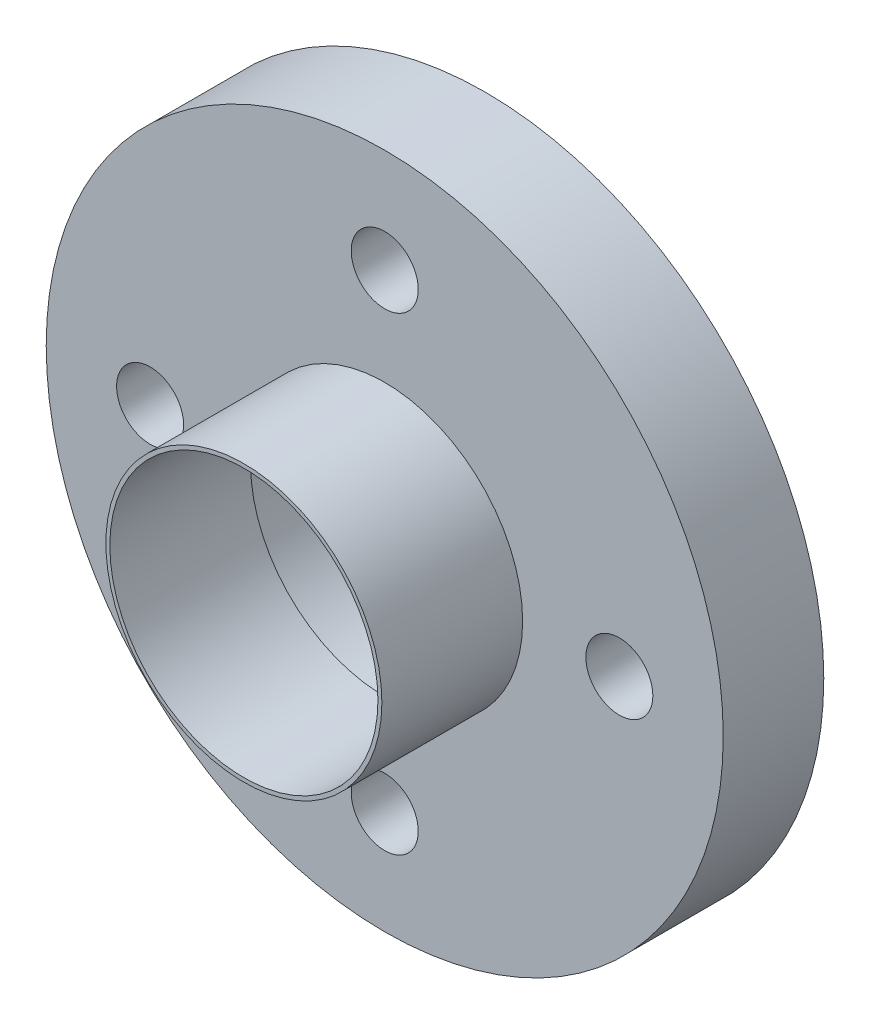
ISO-10303-21;
HEADER;
FILE_DESCRIPTION(('STEP AP214'),'2;1');
FILE_NAME('part.step','',(''),(''),'','','');
FILE_SCHEMA(('AUTOMOTIVE_DESIGN { 1 0 10303 214 1 1 1 1 }'));
ENDSEC;
DATA;
#1=APPLICATION_CONTEXT('core data for automotive mechanical design processes');
#2=APPLICATION_PROTOCOL_DEFINITION('international standard','automotive_design',2000,#1);
#3=PRODUCT_CONTEXT('',#1,'mechanical');
#4=PRODUCT('Part','Part','',(#3));
#5=PRODUCT_RELATED_PRODUCT_CATEGORY('part','',(#4));
#6=PRODUCT_DEFINITION_FORMATION('','',#4);
#7=PRODUCT_DEFINITION_CONTEXT('part definition',#1,'design');
#8=PRODUCT_DEFINITION('design','',#6,#7);
#9=PRODUCT_DEFINITION_SHAPE('','',#8);
#10=(LENGTH_UNIT() NAMED_UNIT(*) SI_UNIT(.MILLI.,.METRE.));
#11=(NAMED_UNIT(*) PLANE_ANGLE_UNIT() SI_UNIT($,.RADIAN.));
#12=(NAMED_UNIT(*) SI_UNIT($,.STERADIAN.) SOLID_ANGLE_UNIT());
#13=UNCERTAINTY_MEASURE_WITH_UNIT(LENGTH_MEASURE(1.E-05),#10,'distance_accuracy_value','');
#14=(GEOMETRIC_REPRESENTATION_CONTEXT(3) GLOBAL_UNCERTAINTY_ASSIGNED_CONTEXT((#13)) GLOBAL_UNIT_ASSIGNED_CONTEXT((#10,
#11,#12)) REPRESENTATION_CONTEXT('',''));
#15=CARTESIAN_POINT('',(0.,0.,0.));
#16=DIRECTION('',(0.,0.,1.));
#17=DIRECTION('',(1.,0.,0.));
#18=AXIS2_PLACEMENT_3D('',#15,#16,#17);
#19=CARTESIAN_POINT('',(-49.827317291707,-8.99276735050377,7.2));
#20=DIRECTION('',(0.,0.,1.));
#21=DIRECTION('',(1.,0.,0.));
#22=AXIS2_PLACEMENT_3D('',#19,#20,#21);
#23=PLANE('',#22);
#24=CARTESIAN_POINT('',(-49.827317291707,-8.99276735050377,7.2));
#25=DIRECTION('',(0.,0.,1.));
#26=DIRECTION('',(1.,0.,0.));
#27=AXIS2_PLACEMENT_3D('',#24,#25,#26);
#28=CIRCLE('',#27,4.1172952718397);
#29=CARTESIAN_POINT('',(-45.7100220198674,-8.99276735050377,7.2));
#30=VERTEX_POINT('',#29);
#31=EDGE_CURVE('E11',#30,#30,#28,.T.);
#32=ORIENTED_EDGE('',*,*,#31,.T.);
#33=EDGE_LOOP('',(#32));
#34=FACE_BOUND('',#33,.T.);
#35=CARTESIAN_POINT('',(-49.827317291707,-8.99276735050377,7.2));
#36=DIRECTION('',(0.,0.,1.));
#37=DIRECTION('',(1.,0.,0.));
#38=AXIS2_PLACEMENT_3D('',#35,#36,#37);
#39=CIRCLE('',#38,4.);
#40=CARTESIAN_POINT('',(-45.8273172917071,-8.99276735050377,7.2));
#41=VERTEX_POINT('',#40);
#42=EDGE_CURVE('E56',#41,#41,#39,.T.);
#43=ORIENTED_EDGE('',*,*,#42,.F.);
#44=EDGE_LOOP('',(#43));
#45=FACE_BOUND('',#44,.T.);
#46=ADVANCED_FACE('F45',(#34,#45),#23,.T.);
#47=CARTESIAN_POINT('',(-49.827317291707,-8.99276735050377,3.));
#48=DIRECTION('',(0.,0.,1.));
#49=DIRECTION('',(1.,0.,0.));
#50=AXIS2_PLACEMENT_3D('',#47,#48,#49);
#51=PLANE('',#50);
#52=CARTESIAN_POINT('',(-49.827317291707,-8.99276735050377,3.));
#53=DIRECTION('',(0.,0.,1.));
#54=DIRECTION('',(1.,0.,0.));
#55=AXIS2_PLACEMENT_3D('',#52,#53,#54);
#56=CIRCLE('',#55,4.1172952718397);
#57=CARTESIAN_POINT('',(-45.7100220198674,-8.99276735050377,3.));
#58=VERTEX_POINT('',#57);
#59=EDGE_CURVE('E49',#58,#58,#56,.T.);
#60=ORIENTED_EDGE('',*,*,#59,.F.);
#61=EDGE_LOOP('',(#60));
#62=FACE_BOUND('',#61,.T.);
#63=CARTESIAN_POINT('',(-49.827317291707,-8.99276735050377,3.));
#64=DIRECTION('',(0.,0.,1.));
#65=DIRECTION('',(1.,0.,0.));
#66=AXIS2_PLACEMENT_3D('',#63,#64,#65);
#67=CIRCLE('',#66,4.);
#68=CARTESIAN_POINT('',(-45.8273172917071,-8.99276735050377,3.));
#69=VERTEX_POINT('',#68);
#70=EDGE_CURVE('E58',#69,#69,#67,.T.);
#71=ORIENTED_EDGE('',*,*,#70,.T.);
#72=EDGE_LOOP('',(#71));
#73=FACE_BOUND('',#72,.T.);
#74=ADVANCED_FACE('F68',(#62,#73),#51,.F.);
#75=CARTESIAN_POINT('',(-49.827317291707,-8.99276735050377,7.2));
#76=DIRECTION('',(0.,0.,-1.));
#77=DIRECTION('',(-1.,0.,0.));
#78=AXIS2_PLACEMENT_3D('',#75,#76,#77);
#79=CYLINDRICAL_SURFACE('',#78,4.1172952718397);
#80=ORIENTED_EDGE('',*,*,#31,.F.);
#81=EDGE_LOOP('',(#80));
#82=FACE_BOUND('',#81,.T.);
#83=ORIENTED_EDGE('',*,*,#59,.T.);
#84=EDGE_LOOP('',(#83));
#85=FACE_BOUND('',#84,.T.);
#86=ADVANCED_FACE('F47',(#82,#85),#79,.T.);
#87=CARTESIAN_POINT('',(-49.827317291707,-8.99276735050377,7.2));
#88=DIRECTION('',(0.,0.,-1.));
#89=DIRECTION('',(-1.,0.,0.));
#90=AXIS2_PLACEMENT_3D('',#87,#88,#89);
#91=CYLINDRICAL_SURFACE('',#90,4.);
#92=ORIENTED_EDGE('',*,*,#42,.T.);
#93=EDGE_LOOP('',(#92));
#94=FACE_BOUND('',#93,.T.);
#95=ORIENTED_EDGE('',*,*,#70,.F.);
#96=EDGE_LOOP('',(#95));
#97=FACE_BOUND('',#96,.T.);
#98=ADVANCED_FACE('F64',(#94,#97),#91,.F.);
#99=CLOSED_SHELL('',(#46,#74,#86,#98));
#100=MANIFOLD_SOLID_BREP('B2',#99);
#101=CARTESIAN_POINT('',(-49.8250755436057,-8.97561797752809,3.));
#102=DIRECTION('',(0.,0.,-1.));
#103=DIRECTION('',(-1.,0.,0.));
#104=AXIS2_PLACEMENT_3D('',#101,#102,#103);
#105=PLANE('',#104);
#106=CARTESIAN_POINT('',(-49.8250755436057,-8.97561797752809,3.));
#107=DIRECTION('',(0.,0.,1.));
#108=DIRECTION('',(-1.,0.,0.));
#109=AXIS2_PLACEMENT_3D('',#106,#107,#108);
#110=CIRCLE('',#109,10.1);
#111=CARTESIAN_POINT('',(-59.9250755436057,-8.97561797752809,3.));
#112=VERTEX_POINT('',#111);
#113=EDGE_CURVE('E44',#112,#112,#110,.T.);
#114=ORIENTED_EDGE('',*,*,#113,.T.);
#115=EDGE_LOOP('',(#114));
#116=FACE_BOUND('',#115,.T.);
#117=CARTESIAN_POINT('',(-49.8250755436057,-15.9756179775281,3.));
#118=DIRECTION('',(0.,0.,1.));
#119=DIRECTION('',(1.,0.,0.));
#120=AXIS2_PLACEMENT_3D('',#117,#118,#119);
#121=CIRCLE('',#120,0.999999999999998);
#122=CARTESIAN_POINT('',(-48.8250755436057,-15.9756179775281,3.));
#123=VERTEX_POINT('',#122);
#124=EDGE_CURVE('E119',#123,#123,#121,.T.);
#125=ORIENTED_EDGE('',*,*,#124,.F.);
#126=EDGE_LOOP('',(#125));
#127=FACE_BOUND('',#126,.T.);
#128=CARTESIAN_POINT('',(-56.8250755436057,-8.97561797752807,3.));
#129=DIRECTION('',(0.,0.,1.));
#130=DIRECTION('',(1.,0.,0.));
#131=AXIS2_PLACEMENT_3D('',#128,#129,#130);
#132=CIRCLE('',#131,1.);
#133=CARTESIAN_POINT('',(-55.8250755436057,-8.97561797752807,3.));
#134=VERTEX_POINT('',#133);
#135=EDGE_CURVE('E125',#134,#134,#132,.T.);
#136=ORIENTED_EDGE('',*,*,#135,.F.);
#137=EDGE_LOOP('',(#136));
#138=FACE_BOUND('',#137,.T.);
#139=CARTESIAN_POINT('',(-49.8250755436056,-1.97561797752809,3.));
#140=DIRECTION('',(0.,0.,1.));
#141=DIRECTION('',(1.,0.,0.));
#142=AXIS2_PLACEMENT_3D('',#139,#140,#141);
#143=CIRCLE('',#142,1.);
#144=CARTESIAN_POINT('',(-48.8250755436056,-1.97561797752809,3.));
#145=VERTEX_POINT('',#144);
#146=EDGE_CURVE('E133',#145,#145,#143,.T.);
#147=ORIENTED_EDGE('',*,*,#146,.F.);
#148=EDGE_LOOP('',(#147));
#149=FACE_BOUND('',#148,.T.);
#150=CARTESIAN_POINT('',(-42.8250755436057,-8.97561797752817,3.));
#151=DIRECTION('',(0.,0.,1.));
#152=DIRECTION('',(1.,0.,0.));
#153=AXIS2_PLACEMENT_3D('',#150,#151,#152);
#154=CIRCLE('',#153,1.);
#155=CARTESIAN_POINT('',(-41.8250755436057,-8.97561797752817,3.));
#156=VERTEX_POINT('',#155);
#157=EDGE_CURVE('E141',#156,#156,#154,.T.);
#158=ORIENTED_EDGE('',*,*,#157,.F.);
#159=EDGE_LOOP('',(#158));
#160=FACE_BOUND('',#159,.T.);
#161=CARTESIAN_POINT('',(-49.8250755436057,-8.97561797752809,3.));
#162=DIRECTION('',(0.,0.,1.));
#163=DIRECTION('',(1.,0.,0.));
#164=AXIS2_PLACEMENT_3D('',#161,#162,#163);
#165=CIRCLE('',#164,4.1);
#166=CARTESIAN_POINT('',(-45.7250755436057,-8.97561797752809,3.));
#167=VERTEX_POINT('',#166);
#168=EDGE_CURVE('E149',#167,#167,#165,.T.);
#169=ORIENTED_EDGE('',*,*,#168,.F.);
#170=EDGE_LOOP('',(#169));
#171=FACE_BOUND('',#170,.T.);
#172=ADVANCED_FACE('F106',(#116,#127,#138,#149,#160,#171),#105,.F.);
#173=CARTESIAN_POINT('',(-49.8250755436057,-8.97561797752809,0.));
#174=DIRECTION('',(0.,0.,-1.));
#175=DIRECTION('',(-1.,0.,0.));
#176=AXIS2_PLACEMENT_3D('',#173,#174,#175);
#177=PLANE('',#176);
#178=CARTESIAN_POINT('',(-42.8250755436057,-8.97561797752817,0.));
#179=DIRECTION('',(0.,0.,1.));
#180=DIRECTION('',(1.,0.,0.));
#181=AXIS2_PLACEMENT_3D('',#178,#179,#180);
#182=CIRCLE('',#181,1.);
#183=CARTESIAN_POINT('',(-41.8250755436057,-8.97561797752817,0.));
#184=VERTEX_POINT('',#183);
#185=EDGE_CURVE('E145',#184,#184,#182,.T.);
#186=ORIENTED_EDGE('',*,*,#185,.T.);
#187=EDGE_LOOP('',(#186));
#188=FACE_BOUND('',#187,.T.);
#189=CARTESIAN_POINT('',(-56.8250755436057,-8.97561797752807,0.));
#190=DIRECTION('',(0.,0.,1.));
#191=DIRECTION('',(1.,0.,0.));
#192=AXIS2_PLACEMENT_3D('',#189,#190,#191);
#193=CIRCLE('',#192,1.);
#194=CARTESIAN_POINT('',(-55.8250755436057,-8.97561797752807,0.));
#195=VERTEX_POINT('',#194);
#196=EDGE_CURVE('E129',#195,#195,#193,.T.);
#197=ORIENTED_EDGE('',*,*,#196,.T.);
#198=EDGE_LOOP('',(#197));
#199=FACE_BOUND('',#198,.T.);
#200=CARTESIAN_POINT('',(-49.8250755436057,-8.97561797752809,0.));
#201=DIRECTION('',(0.,0.,1.));
#202=DIRECTION('',(1.,0.,0.));
#203=AXIS2_PLACEMENT_3D('',#200,#201,#202);
#204=CIRCLE('',#203,10.1);
#205=CARTESIAN_POINT('',(-39.7250755436057,-8.97561797752809,0.));
#206=VERTEX_POINT('',#205);
#207=EDGE_CURVE('E110',#206,#206,#204,.T.);
#208=ORIENTED_EDGE('',*,*,#207,.F.);
#209=EDGE_LOOP('',(#208));
#210=FACE_BOUND('',#209,.T.);
#211=CARTESIAN_POINT('',(-49.8250755436057,-15.9756179775281,0.));
#212=DIRECTION('',(0.,0.,1.));
#213=DIRECTION('',(1.,0.,0.));
#214=AXIS2_PLACEMENT_3D('',#211,#212,#213);
#215=CIRCLE('',#214,0.999999999999998);
#216=CARTESIAN_POINT('',(-48.8250755436057,-15.9756179775281,0.));
#217=VERTEX_POINT('',#216);
#218=EDGE_CURVE('E121',#217,#217,#215,.T.);
#219=ORIENTED_EDGE('',*,*,#218,.T.);
#220=EDGE_LOOP('',(#219));
#221=FACE_BOUND('',#220,.T.);
#222=CARTESIAN_POINT('',(-49.8250755436056,-1.97561797752809,0.));
#223=DIRECTION('',(0.,0.,1.));
#224=DIRECTION('',(1.,0.,0.));
#225=AXIS2_PLACEMENT_3D('',#222,#223,#224);
#226=CIRCLE('',#225,1.);
#227=CARTESIAN_POINT('',(-48.8250755436056,-1.97561797752809,0.));
#228=VERTEX_POINT('',#227);
#229=EDGE_CURVE('E137',#228,#228,#226,.T.);
#230=ORIENTED_EDGE('',*,*,#229,.T.);
#231=EDGE_LOOP('',(#230));
#232=FACE_BOUND('',#231,.T.);
#233=CARTESIAN_POINT('',(-49.8250755436057,-8.97561797752809,0.));
#234=DIRECTION('',(0.,0.,1.));
#235=DIRECTION('',(1.,0.,0.));
#236=AXIS2_PLACEMENT_3D('',#233,#234,#235);
#237=CIRCLE('',#236,4.1);
#238=CARTESIAN_POINT('',(-45.7250755436057,-8.97561797752809,0.));
#239=VERTEX_POINT('',#238);
#240=EDGE_CURVE('E153',#239,#239,#237,.T.);
#241=ORIENTED_EDGE('',*,*,#240,.T.);
#242=EDGE_LOOP('',(#241));
#243=FACE_BOUND('',#242,.T.);
#244=ADVANCED_FACE('F165',(#188,#199,#210,#221,#232,#243),#177,.T.);
#245=CARTESIAN_POINT('',(-49.8250755436057,-8.97561797752809,3.));
#246=DIRECTION('',(0.,0.,-1.));
#247=DIRECTION('',(-1.,0.,0.));
#248=AXIS2_PLACEMENT_3D('',#245,#246,#247);
#249=CYLINDRICAL_SURFACE('',#248,10.1);
#250=ORIENTED_EDGE('',*,*,#207,.T.);
#251=EDGE_LOOP('',(#250));
#252=FACE_BOUND('',#251,.T.);
#253=ORIENTED_EDGE('',*,*,#113,.F.);
#254=EDGE_LOOP('',(#253));
#255=FACE_BOUND('',#254,.T.);
#256=ADVANCED_FACE('F108',(#252,#255),#249,.T.);
#257=CARTESIAN_POINT('',(-49.8250755436057,-15.9756179775281,3.));
#258=DIRECTION('',(0.,0.,-1.));
#259=DIRECTION('',(-1.,0.,0.));
#260=AXIS2_PLACEMENT_3D('',#257,#258,#259);
#261=CYLINDRICAL_SURFACE('',#260,0.999999999999998);
#262=ORIENTED_EDGE('',*,*,#124,.T.);
#263=EDGE_LOOP('',(#262));
#264=FACE_BOUND('',#263,.T.);
#265=ORIENTED_EDGE('',*,*,#218,.F.);
#266=EDGE_LOOP('',(#265));
#267=FACE_BOUND('',#266,.T.);
#268=ADVANCED_FACE('F173',(#264,#267),#261,.F.);
#269=CARTESIAN_POINT('',(-56.8250755436057,-8.97561797752807,3.));
#270=DIRECTION('',(0.,0.,-1.));
#271=DIRECTION('',(-1.,0.,0.));
#272=AXIS2_PLACEMENT_3D('',#269,#270,#271);
#273=CYLINDRICAL_SURFACE('',#272,1.);
#274=ORIENTED_EDGE('',*,*,#135,.T.);
#275=EDGE_LOOP('',(#274));
#276=FACE_BOUND('',#275,.T.);
#277=ORIENTED_EDGE('',*,*,#196,.F.);
#278=EDGE_LOOP('',(#277));
#279=FACE_BOUND('',#278,.T.);
#280=ADVANCED_FACE('F176',(#276,#279),#273,.F.);
#281=CARTESIAN_POINT('',(-49.8250755436056,-1.97561797752809,3.));
#282=DIRECTION('',(0.,0.,-1.));
#283=DIRECTION('',(-1.,0.,0.));
#284=AXIS2_PLACEMENT_3D('',#281,#282,#283);
#285=CYLINDRICAL_SURFACE('',#284,1.);
#286=ORIENTED_EDGE('',*,*,#146,.T.);
#287=EDGE_LOOP('',(#286));
#288=FACE_BOUND('',#287,.T.);
#289=ORIENTED_EDGE('',*,*,#229,.F.);
#290=EDGE_LOOP('',(#289));
#291=FACE_BOUND('',#290,.T.);
#292=ADVANCED_FACE('F180',(#288,#291),#285,.F.);
#293=CARTESIAN_POINT('',(-42.8250755436057,-8.97561797752817,3.));
#294=DIRECTION('',(0.,0.,-1.));
#295=DIRECTION('',(-1.,0.,0.));
#296=AXIS2_PLACEMENT_3D('',#293,#294,#295);
#297=CYLINDRICAL_SURFACE('',#296,1.);
#298=ORIENTED_EDGE('',*,*,#157,.T.);
#299=EDGE_LOOP('',(#298));
#300=FACE_BOUND('',#299,.T.);
#301=ORIENTED_EDGE('',*,*,#185,.F.);
#302=EDGE_LOOP('',(#301));
#303=FACE_BOUND('',#302,.T.);
#304=ADVANCED_FACE('F184',(#300,#303),#297,.F.);
#305=CARTESIAN_POINT('',(-49.8250755436057,-8.97561797752809,3.));
#306=DIRECTION('',(0.,0.,-1.));
#307=DIRECTION('',(-1.,0.,0.));
#308=AXIS2_PLACEMENT_3D('',#305,#306,#307);
#309=CYLINDRICAL_SURFACE('',#308,4.1);
#310=ORIENTED_EDGE('',*,*,#168,.T.);
#311=EDGE_LOOP('',(#310));
#312=FACE_BOUND('',#311,.T.);
#313=ORIENTED_EDGE('',*,*,#240,.F.);
#314=EDGE_LOOP('',(#313));
#315=FACE_BOUND('',#314,.T.);
#316=ADVANCED_FACE('F161',(#312,#315),#309,.F.);
#317=CLOSED_SHELL('',(#172,#244,#256,#268,#280,#292,#304,#316));
#318=MANIFOLD_SOLID_BREP('B6',#317);
#319=ADVANCED_BREP_SHAPE_REPRESENTATION('',(#18,#100,#318),#14);
#320=SHAPE_DEFINITION_REPRESENTATION(#9,#319);
ENDSEC;
END-ISO-10303-21;
